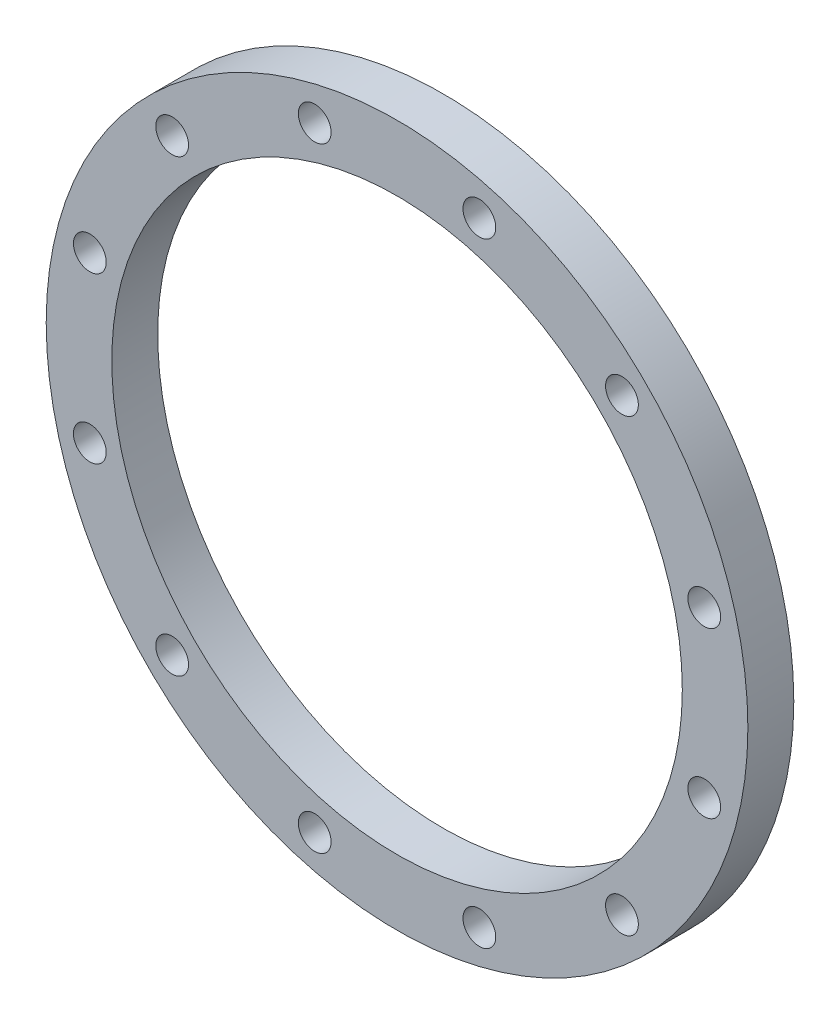
ISO-10303-21;
HEADER;
FILE_DESCRIPTION(('STEP AP214'),'2;1');
FILE_NAME('part.step','',(''),(''),'','','');
FILE_SCHEMA(('AUTOMOTIVE_DESIGN { 1 0 10303 214 1 1 1 1 }'));
ENDSEC;
DATA;
#1=APPLICATION_CONTEXT('core data for automotive mechanical design processes');
#2=APPLICATION_PROTOCOL_DEFINITION('international standard','automotive_design',2000,#1);
#3=PRODUCT_CONTEXT('',#1,'mechanical');
#4=PRODUCT('Part','Part','',(#3));
#5=PRODUCT_RELATED_PRODUCT_CATEGORY('part','',(#4));
#6=PRODUCT_DEFINITION_FORMATION('','',#4);
#7=PRODUCT_DEFINITION_CONTEXT('part definition',#1,'design');
#8=PRODUCT_DEFINITION('design','',#6,#7);
#9=PRODUCT_DEFINITION_SHAPE('','',#8);
#10=(LENGTH_UNIT() NAMED_UNIT(*) SI_UNIT(.MILLI.,.METRE.));
#11=(NAMED_UNIT(*) PLANE_ANGLE_UNIT() SI_UNIT($,.RADIAN.));
#12=(NAMED_UNIT(*) SI_UNIT($,.STERADIAN.) SOLID_ANGLE_UNIT());
#13=UNCERTAINTY_MEASURE_WITH_UNIT(LENGTH_MEASURE(1.E-05),#10,'distance_accuracy_value','');
#14=(GEOMETRIC_REPRESENTATION_CONTEXT(3) GLOBAL_UNCERTAINTY_ASSIGNED_CONTEXT((#13)) GLOBAL_UNIT_ASSIGNED_CONTEXT((#10,
#11,#12)) REPRESENTATION_CONTEXT('',''));
#15=CARTESIAN_POINT('',(0.,0.,0.));
#16=DIRECTION('',(0.,0.,1.));
#17=DIRECTION('',(1.,0.,0.));
#18=AXIS2_PLACEMENT_3D('',#15,#16,#17);
#19=CARTESIAN_POINT('',(0.,0.,70.));
#20=DIRECTION('',(0.,0.,1.));
#21=DIRECTION('',(1.,0.,0.));
#22=AXIS2_PLACEMENT_3D('',#19,#20,#21);
#23=PLANE('',#22);
#24=CARTESIAN_POINT('',(342.946788875482,342.946788875469,70.));
#25=DIRECTION('',(0.,0.,1.));
#26=DIRECTION('',(1.,0.,0.));
#27=AXIS2_PLACEMENT_3D('',#24,#25,#26);
#28=CIRCLE('',#27,25.);
#29=CARTESIAN_POINT('',(367.946788875482,342.946788875469,70.));
#30=VERTEX_POINT('',#29);
#31=EDGE_CURVE('E47',#30,#30,#28,.T.);
#32=ORIENTED_EDGE('',*,*,#31,.F.);
#33=EDGE_LOOP('',(#32));
#34=FACE_BOUND('',#33,.T.);
#35=CARTESIAN_POINT('',(468.474025750204,125.527236874702,70.));
#36=DIRECTION('',(0.,0.,1.));
#37=DIRECTION('',(1.,0.,0.));
#38=AXIS2_PLACEMENT_3D('',#35,#36,#37);
#39=CIRCLE('',#38,25.);
#40=CARTESIAN_POINT('',(493.474025750204,125.527236874702,70.));
#41=VERTEX_POINT('',#40);
#42=EDGE_CURVE('E52',#41,#41,#39,.T.);
#43=ORIENTED_EDGE('',*,*,#42,.F.);
#44=EDGE_LOOP('',(#43));
#45=FACE_BOUND('',#44,.T.);
#46=CARTESIAN_POINT('',(468.474025750189,-125.527236874755,70.));
#47=DIRECTION('',(0.,0.,1.));
#48=DIRECTION('',(1.,0.,0.));
#49=AXIS2_PLACEMENT_3D('',#46,#47,#48);
#50=CIRCLE('',#49,25.);
#51=CARTESIAN_POINT('',(493.474025750189,-125.527236874755,70.));
#52=VERTEX_POINT('',#51);
#53=EDGE_CURVE('E55',#52,#52,#50,.T.);
#54=ORIENTED_EDGE('',*,*,#53,.F.);
#55=EDGE_LOOP('',(#54));
#56=FACE_BOUND('',#55,.T.);
#57=CARTESIAN_POINT('',(342.946788875443,-342.946788875508,70.));
#58=DIRECTION('',(0.,0.,1.));
#59=DIRECTION('',(1.,0.,0.));
#60=AXIS2_PLACEMENT_3D('',#57,#58,#59);
#61=CIRCLE('',#60,25.);
#62=CARTESIAN_POINT('',(367.946788875443,-342.946788875508,70.));
#63=VERTEX_POINT('',#62);
#64=EDGE_CURVE('E58',#63,#63,#61,.T.);
#65=ORIENTED_EDGE('',*,*,#64,.F.);
#66=EDGE_LOOP('',(#65));
#67=FACE_BOUND('',#66,.T.);
#68=CARTESIAN_POINT('',(125.527236874666,-468.474025750213,70.));
#69=DIRECTION('',(0.,0.,1.));
#70=DIRECTION('',(1.,0.,0.));
#71=AXIS2_PLACEMENT_3D('',#68,#69,#70);
#72=CIRCLE('',#71,25.);
#73=CARTESIAN_POINT('',(150.527236874666,-468.474025750213,70.));
#74=VERTEX_POINT('',#73);
#75=EDGE_CURVE('E61',#74,#74,#72,.T.);
#76=ORIENTED_EDGE('',*,*,#75,.F.);
#77=EDGE_LOOP('',(#76));
#78=FACE_BOUND('',#77,.T.);
#79=CARTESIAN_POINT('',(-125.527236874791,-468.47402575018,70.));
#80=DIRECTION('',(0.,0.,1.));
#81=DIRECTION('',(1.,0.,0.));
#82=AXIS2_PLACEMENT_3D('',#79,#80,#81);
#83=CIRCLE('',#82,25.);
#84=CARTESIAN_POINT('',(-100.527236874791,-468.47402575018,70.));
#85=VERTEX_POINT('',#84);
#86=EDGE_CURVE('E64',#85,#85,#83,.T.);
#87=ORIENTED_EDGE('',*,*,#86,.F.);
#88=EDGE_LOOP('',(#87));
#89=FACE_BOUND('',#88,.T.);
#90=CARTESIAN_POINT('',(-342.946788875534,-342.946788875417,70.));
#91=DIRECTION('',(0.,0.,1.));
#92=DIRECTION('',(1.,0.,0.));
#93=AXIS2_PLACEMENT_3D('',#90,#91,#92);
#94=CIRCLE('',#93,25.);
#95=CARTESIAN_POINT('',(-317.946788875534,-342.946788875417,70.));
#96=VERTEX_POINT('',#95);
#97=EDGE_CURVE('E67',#96,#96,#94,.T.);
#98=ORIENTED_EDGE('',*,*,#97,.F.);
#99=EDGE_LOOP('',(#98));
#100=FACE_BOUND('',#99,.T.);
#101=CARTESIAN_POINT('',(-468.474025750223,-125.527236874631,70.));
#102=DIRECTION('',(0.,0.,1.));
#103=DIRECTION('',(1.,0.,0.));
#104=AXIS2_PLACEMENT_3D('',#101,#102,#103);
#105=CIRCLE('',#104,25.);
#106=CARTESIAN_POINT('',(-443.474025750223,-125.527236874631,70.));
#107=VERTEX_POINT('',#106);
#108=EDGE_CURVE('E70',#107,#107,#105,.T.);
#109=ORIENTED_EDGE('',*,*,#108,.F.);
#110=EDGE_LOOP('',(#109));
#111=FACE_BOUND('',#110,.T.);
#112=CARTESIAN_POINT('',(-468.47402575017,125.527236874826,70.));
#113=DIRECTION('',(0.,0.,1.));
#114=DIRECTION('',(1.,0.,0.));
#115=AXIS2_PLACEMENT_3D('',#112,#113,#114);
#116=CIRCLE('',#115,25.);
#117=CARTESIAN_POINT('',(-443.47402575017,125.527236874826,70.));
#118=VERTEX_POINT('',#117);
#119=EDGE_CURVE('E73',#118,#118,#116,.T.);
#120=ORIENTED_EDGE('',*,*,#119,.F.);
#121=EDGE_LOOP('',(#120));
#122=FACE_BOUND('',#121,.T.);
#123=CARTESIAN_POINT('',(-342.946788875391,342.94678887556,70.));
#124=DIRECTION('',(0.,0.,1.));
#125=DIRECTION('',(1.,0.,0.));
#126=AXIS2_PLACEMENT_3D('',#123,#124,#125);
#127=CIRCLE('',#126,25.);
#128=CARTESIAN_POINT('',(-317.946788875391,342.94678887556,70.));
#129=VERTEX_POINT('',#128);
#130=EDGE_CURVE('E76',#129,#129,#127,.T.);
#131=ORIENTED_EDGE('',*,*,#130,.F.);
#132=EDGE_LOOP('',(#131));
#133=FACE_BOUND('',#132,.T.);
#134=CARTESIAN_POINT('',(-125.527236874595,468.474025750232,70.));
#135=DIRECTION('',(0.,0.,1.));
#136=DIRECTION('',(1.,0.,0.));
#137=AXIS2_PLACEMENT_3D('',#134,#135,#136);
#138=CIRCLE('',#137,25.);
#139=CARTESIAN_POINT('',(-100.527236874595,468.474025750232,70.));
#140=VERTEX_POINT('',#139);
#141=EDGE_CURVE('E79',#140,#140,#138,.T.);
#142=ORIENTED_EDGE('',*,*,#141,.F.);
#143=EDGE_LOOP('',(#142));
#144=FACE_BOUND('',#143,.T.);
#145=CARTESIAN_POINT('',(125.527236874719,468.474025750199,70.));
#146=DIRECTION('',(0.,0.,1.));
#147=DIRECTION('',(1.,0.,0.));
#148=AXIS2_PLACEMENT_3D('',#145,#146,#147);
#149=CIRCLE('',#148,24.9999999999997);
#150=CARTESIAN_POINT('',(150.527236874719,468.474025750199,70.));
#151=VERTEX_POINT('',#150);
#152=EDGE_CURVE('E82',#151,#151,#149,.T.);
#153=ORIENTED_EDGE('',*,*,#152,.F.);
#154=EDGE_LOOP('',(#153));
#155=FACE_BOUND('',#154,.T.);
#156=CARTESIAN_POINT('',(0.,0.,70.));
#157=DIRECTION('',(0.,0.,1.));
#158=DIRECTION('',(1.,0.,0.));
#159=AXIS2_PLACEMENT_3D('',#156,#157,#158);
#160=CIRCLE('',#159,535.);
#161=CARTESIAN_POINT('',(535.,0.,70.));
#162=VERTEX_POINT('',#161);
#163=EDGE_CURVE('E10',#162,#162,#160,.T.);
#164=ORIENTED_EDGE('',*,*,#163,.T.);
#165=EDGE_LOOP('',(#164));
#166=FACE_BOUND('',#165,.T.);
#167=CARTESIAN_POINT('',(0.,0.,70.));
#168=DIRECTION('',(0.,0.,1.));
#169=DIRECTION('',(1.,0.,0.));
#170=AXIS2_PLACEMENT_3D('',#167,#168,#169);
#171=CIRCLE('',#170,435.);
#172=CARTESIAN_POINT('',(435.,0.,70.));
#173=VERTEX_POINT('',#172);
#174=EDGE_CURVE('E42',#173,#173,#171,.T.);
#175=ORIENTED_EDGE('',*,*,#174,.F.);
#176=EDGE_LOOP('',(#175));
#177=FACE_BOUND('',#176,.T.);
#178=ADVANCED_FACE('F31',(#34,#45,#56,#67,#78,#89,#100,#111,#122,#133,#144,#155,#166,#177),#23,.T.);
#179=CARTESIAN_POINT('',(0.,0.,0.));
#180=DIRECTION('',(0.,0.,1.));
#181=DIRECTION('',(1.,0.,0.));
#182=AXIS2_PLACEMENT_3D('',#179,#180,#181);
#183=PLANE('',#182);
#184=CARTESIAN_POINT('',(342.946788875482,342.946788875469,0.));
#185=DIRECTION('',(0.,0.,1.));
#186=DIRECTION('',(1.,0.,0.));
#187=AXIS2_PLACEMENT_3D('',#184,#185,#186);
#188=CIRCLE('',#187,25.);
#189=CARTESIAN_POINT('',(367.946788875482,342.946788875469,0.));
#190=VERTEX_POINT('',#189);
#191=EDGE_CURVE('E88',#190,#190,#188,.T.);
#192=ORIENTED_EDGE('',*,*,#191,.T.);
#193=EDGE_LOOP('',(#192));
#194=FACE_BOUND('',#193,.T.);
#195=CARTESIAN_POINT('',(468.474025750204,125.527236874702,0.));
#196=DIRECTION('',(0.,0.,1.));
#197=DIRECTION('',(1.,0.,0.));
#198=AXIS2_PLACEMENT_3D('',#195,#196,#197);
#199=CIRCLE('',#198,25.);
#200=CARTESIAN_POINT('',(493.474025750204,125.527236874702,0.));
#201=VERTEX_POINT('',#200);
#202=EDGE_CURVE('E108',#201,#201,#199,.T.);
#203=ORIENTED_EDGE('',*,*,#202,.T.);
#204=EDGE_LOOP('',(#203));
#205=FACE_BOUND('',#204,.T.);
#206=CARTESIAN_POINT('',(468.474025750189,-125.527236874755,0.));
#207=DIRECTION('',(0.,0.,1.));
#208=DIRECTION('',(1.,0.,0.));
#209=AXIS2_PLACEMENT_3D('',#206,#207,#208);
#210=CIRCLE('',#209,25.);
#211=CARTESIAN_POINT('',(493.474025750189,-125.527236874755,0.));
#212=VERTEX_POINT('',#211);
#213=EDGE_CURVE('E105',#212,#212,#210,.T.);
#214=ORIENTED_EDGE('',*,*,#213,.T.);
#215=EDGE_LOOP('',(#214));
#216=FACE_BOUND('',#215,.T.);
#217=CARTESIAN_POINT('',(342.946788875443,-342.946788875508,0.));
#218=DIRECTION('',(0.,0.,1.));
#219=DIRECTION('',(1.,0.,0.));
#220=AXIS2_PLACEMENT_3D('',#217,#218,#219);
#221=CIRCLE('',#220,25.);
#222=CARTESIAN_POINT('',(367.946788875443,-342.946788875508,0.));
#223=VERTEX_POINT('',#222);
#224=EDGE_CURVE('E102',#223,#223,#221,.T.);
#225=ORIENTED_EDGE('',*,*,#224,.T.);
#226=EDGE_LOOP('',(#225));
#227=FACE_BOUND('',#226,.T.);
#228=CARTESIAN_POINT('',(125.527236874666,-468.474025750213,0.));
#229=DIRECTION('',(0.,0.,1.));
#230=DIRECTION('',(1.,0.,0.));
#231=AXIS2_PLACEMENT_3D('',#228,#229,#230);
#232=CIRCLE('',#231,25.);
#233=CARTESIAN_POINT('',(150.527236874666,-468.474025750213,0.));
#234=VERTEX_POINT('',#233);
#235=EDGE_CURVE('E99',#234,#234,#232,.T.);
#236=ORIENTED_EDGE('',*,*,#235,.T.);
#237=EDGE_LOOP('',(#236));
#238=FACE_BOUND('',#237,.T.);
#239=CARTESIAN_POINT('',(-125.527236874791,-468.47402575018,0.));
#240=DIRECTION('',(0.,0.,1.));
#241=DIRECTION('',(1.,0.,0.));
#242=AXIS2_PLACEMENT_3D('',#239,#240,#241);
#243=CIRCLE('',#242,25.);
#244=CARTESIAN_POINT('',(-100.527236874791,-468.47402575018,0.));
#245=VERTEX_POINT('',#244);
#246=EDGE_CURVE('E96',#245,#245,#243,.T.);
#247=ORIENTED_EDGE('',*,*,#246,.T.);
#248=EDGE_LOOP('',(#247));
#249=FACE_BOUND('',#248,.T.);
#250=CARTESIAN_POINT('',(-342.946788875534,-342.946788875417,0.));
#251=DIRECTION('',(0.,0.,1.));
#252=DIRECTION('',(1.,0.,0.));
#253=AXIS2_PLACEMENT_3D('',#250,#251,#252);
#254=CIRCLE('',#253,25.);
#255=CARTESIAN_POINT('',(-317.946788875534,-342.946788875417,0.));
#256=VERTEX_POINT('',#255);
#257=EDGE_CURVE('E92',#256,#256,#254,.T.);
#258=ORIENTED_EDGE('',*,*,#257,.T.);
#259=EDGE_LOOP('',(#258));
#260=FACE_BOUND('',#259,.T.);
#261=CARTESIAN_POINT('',(-468.474025750223,-125.527236874631,0.));
#262=DIRECTION('',(0.,0.,1.));
#263=DIRECTION('',(1.,0.,0.));
#264=AXIS2_PLACEMENT_3D('',#261,#262,#263);
#265=CIRCLE('',#264,25.);
#266=CARTESIAN_POINT('',(-443.474025750223,-125.527236874631,0.));
#267=VERTEX_POINT('',#266);
#268=EDGE_CURVE('E89',#267,#267,#265,.T.);
#269=ORIENTED_EDGE('',*,*,#268,.T.);
#270=EDGE_LOOP('',(#269));
#271=FACE_BOUND('',#270,.T.);
#272=CARTESIAN_POINT('',(-468.47402575017,125.527236874826,0.));
#273=DIRECTION('',(0.,0.,1.));
#274=DIRECTION('',(1.,0.,0.));
#275=AXIS2_PLACEMENT_3D('',#272,#273,#274);
#276=CIRCLE('',#275,25.);
#277=CARTESIAN_POINT('',(-443.47402575017,125.527236874826,0.));
#278=VERTEX_POINT('',#277);
#279=EDGE_CURVE('E93',#278,#278,#276,.T.);
#280=ORIENTED_EDGE('',*,*,#279,.T.);
#281=EDGE_LOOP('',(#280));
#282=FACE_BOUND('',#281,.T.);
#283=CARTESIAN_POINT('',(-342.946788875391,342.94678887556,0.));
#284=DIRECTION('',(0.,0.,1.));
#285=DIRECTION('',(1.,0.,0.));
#286=AXIS2_PLACEMENT_3D('',#283,#284,#285);
#287=CIRCLE('',#286,25.);
#288=CARTESIAN_POINT('',(-317.946788875391,342.94678887556,0.));
#289=VERTEX_POINT('',#288);
#290=EDGE_CURVE('E116',#289,#289,#287,.T.);
#291=ORIENTED_EDGE('',*,*,#290,.T.);
#292=EDGE_LOOP('',(#291));
#293=FACE_BOUND('',#292,.T.);
#294=CARTESIAN_POINT('',(-125.527236874595,468.474025750232,0.));
#295=DIRECTION('',(0.,0.,1.));
#296=DIRECTION('',(1.,0.,0.));
#297=AXIS2_PLACEMENT_3D('',#294,#295,#296);
#298=CIRCLE('',#297,25.);
#299=CARTESIAN_POINT('',(-100.527236874595,468.474025750232,0.));
#300=VERTEX_POINT('',#299);
#301=EDGE_CURVE('E113',#300,#300,#298,.T.);
#302=ORIENTED_EDGE('',*,*,#301,.T.);
#303=EDGE_LOOP('',(#302));
#304=FACE_BOUND('',#303,.T.);
#305=CARTESIAN_POINT('',(125.527236874719,468.474025750199,0.));
#306=DIRECTION('',(0.,0.,1.));
#307=DIRECTION('',(1.,0.,0.));
#308=AXIS2_PLACEMENT_3D('',#305,#306,#307);
#309=CIRCLE('',#308,24.9999999999997);
#310=CARTESIAN_POINT('',(150.527236874719,468.474025750199,0.));
#311=VERTEX_POINT('',#310);
#312=EDGE_CURVE('E85',#311,#311,#309,.T.);
#313=ORIENTED_EDGE('',*,*,#312,.T.);
#314=EDGE_LOOP('',(#313));
#315=FACE_BOUND('',#314,.T.);
#316=CARTESIAN_POINT('',(0.,0.,0.));
#317=DIRECTION('',(0.,0.,1.));
#318=DIRECTION('',(1.,0.,0.));
#319=AXIS2_PLACEMENT_3D('',#316,#317,#318);
#320=CIRCLE('',#319,535.);
#321=CARTESIAN_POINT('',(535.,0.,0.));
#322=VERTEX_POINT('',#321);
#323=EDGE_CURVE('E35',#322,#322,#320,.T.);
#324=ORIENTED_EDGE('',*,*,#323,.F.);
#325=EDGE_LOOP('',(#324));
#326=FACE_BOUND('',#325,.T.);
#327=CARTESIAN_POINT('',(0.,0.,0.));
#328=DIRECTION('',(0.,0.,1.));
#329=DIRECTION('',(1.,0.,0.));
#330=AXIS2_PLACEMENT_3D('',#327,#328,#329);
#331=CIRCLE('',#330,435.);
#332=CARTESIAN_POINT('',(435.,0.,0.));
#333=VERTEX_POINT('',#332);
#334=EDGE_CURVE('E44',#333,#333,#331,.T.);
#335=ORIENTED_EDGE('',*,*,#334,.T.);
#336=EDGE_LOOP('',(#335));
#337=FACE_BOUND('',#336,.T.);
#338=ADVANCED_FACE('F122',(#194,#205,#216,#227,#238,#249,#260,#271,#282,#293,#304,#315,#326,
#337),#183,.F.);
#339=CARTESIAN_POINT('',(0.,0.,70.));
#340=DIRECTION('',(0.,0.,-1.));
#341=DIRECTION('',(-1.,0.,0.));
#342=AXIS2_PLACEMENT_3D('',#339,#340,#341);
#343=CYLINDRICAL_SURFACE('',#342,535.);
#344=ORIENTED_EDGE('',*,*,#163,.F.);
#345=EDGE_LOOP('',(#344));
#346=FACE_BOUND('',#345,.T.);
#347=ORIENTED_EDGE('',*,*,#323,.T.);
#348=EDGE_LOOP('',(#347));
#349=FACE_BOUND('',#348,.T.);
#350=ADVANCED_FACE('F33',(#346,#349),#343,.T.);
#351=CARTESIAN_POINT('',(0.,0.,70.));
#352=DIRECTION('',(0.,0.,-1.));
#353=DIRECTION('',(-1.,0.,0.));
#354=AXIS2_PLACEMENT_3D('',#351,#352,#353);
#355=CYLINDRICAL_SURFACE('',#354,435.);
#356=ORIENTED_EDGE('',*,*,#174,.T.);
#357=EDGE_LOOP('',(#356));
#358=FACE_BOUND('',#357,.T.);
#359=ORIENTED_EDGE('',*,*,#334,.F.);
#360=EDGE_LOOP('',(#359));
#361=FACE_BOUND('',#360,.T.);
#362=ADVANCED_FACE('F151',(#358,#361),#355,.F.);
#363=CARTESIAN_POINT('',(125.527236874719,468.474025750199,0.));
#364=DIRECTION('',(0.,0.,1.));
#365=DIRECTION('',(1.,0.,0.));
#366=AXIS2_PLACEMENT_3D('',#363,#364,#365);
#367=CYLINDRICAL_SURFACE('',#366,24.9999999999997);
#368=ORIENTED_EDGE('',*,*,#152,.T.);
#369=EDGE_LOOP('',(#368));
#370=FACE_BOUND('',#369,.T.);
#371=ORIENTED_EDGE('',*,*,#312,.F.);
#372=EDGE_LOOP('',(#371));
#373=FACE_BOUND('',#372,.T.);
#374=ADVANCED_FACE('F154',(#370,#373),#367,.F.);
#375=CARTESIAN_POINT('',(-125.527236874595,468.474025750232,0.));
#376=DIRECTION('',(0.,0.,1.));
#377=DIRECTION('',(1.,0.,0.));
#378=AXIS2_PLACEMENT_3D('',#375,#376,#377);
#379=CYLINDRICAL_SURFACE('',#378,25.);
#380=ORIENTED_EDGE('',*,*,#141,.T.);
#381=EDGE_LOOP('',(#380));
#382=FACE_BOUND('',#381,.T.);
#383=ORIENTED_EDGE('',*,*,#301,.F.);
#384=EDGE_LOOP('',(#383));
#385=FACE_BOUND('',#384,.T.);
#386=ADVANCED_FACE('F138',(#382,#385),#379,.F.);
#387=CARTESIAN_POINT('',(-342.946788875391,342.94678887556,0.));
#388=DIRECTION('',(0.,0.,1.));
#389=DIRECTION('',(1.,0.,0.));
#390=AXIS2_PLACEMENT_3D('',#387,#388,#389);
#391=CYLINDRICAL_SURFACE('',#390,25.);
#392=ORIENTED_EDGE('',*,*,#130,.T.);
#393=EDGE_LOOP('',(#392));
#394=FACE_BOUND('',#393,.T.);
#395=ORIENTED_EDGE('',*,*,#290,.F.);
#396=EDGE_LOOP('',(#395));
#397=FACE_BOUND('',#396,.T.);
#398=ADVANCED_FACE('F128',(#394,#397),#391,.F.);
#399=CARTESIAN_POINT('',(-468.47402575017,125.527236874826,0.));
#400=DIRECTION('',(0.,0.,1.));
#401=DIRECTION('',(1.,0.,0.));
#402=AXIS2_PLACEMENT_3D('',#399,#400,#401);
#403=CYLINDRICAL_SURFACE('',#402,25.);
#404=ORIENTED_EDGE('',*,*,#119,.T.);
#405=EDGE_LOOP('',(#404));
#406=FACE_BOUND('',#405,.T.);
#407=ORIENTED_EDGE('',*,*,#279,.F.);
#408=EDGE_LOOP('',(#407));
#409=FACE_BOUND('',#408,.T.);
#410=ADVANCED_FACE('F125',(#406,#409),#403,.F.);
#411=CARTESIAN_POINT('',(-468.474025750223,-125.527236874631,0.));
#412=DIRECTION('',(0.,0.,1.));
#413=DIRECTION('',(1.,0.,0.));
#414=AXIS2_PLACEMENT_3D('',#411,#412,#413);
#415=CYLINDRICAL_SURFACE('',#414,25.);
#416=ORIENTED_EDGE('',*,*,#108,.T.);
#417=EDGE_LOOP('',(#416));
#418=FACE_BOUND('',#417,.T.);
#419=ORIENTED_EDGE('',*,*,#268,.F.);
#420=EDGE_LOOP('',(#419));
#421=FACE_BOUND('',#420,.T.);
#422=ADVANCED_FACE('F127',(#418,#421),#415,.F.);
#423=CARTESIAN_POINT('',(-342.946788875534,-342.946788875417,0.));
#424=DIRECTION('',(0.,0.,1.));
#425=DIRECTION('',(1.,0.,0.));
#426=AXIS2_PLACEMENT_3D('',#423,#424,#425);
#427=CYLINDRICAL_SURFACE('',#426,25.);
#428=ORIENTED_EDGE('',*,*,#97,.T.);
#429=EDGE_LOOP('',(#428));
#430=FACE_BOUND('',#429,.T.);
#431=ORIENTED_EDGE('',*,*,#257,.F.);
#432=EDGE_LOOP('',(#431));
#433=FACE_BOUND('',#432,.T.);
#434=ADVANCED_FACE('F135',(#430,#433),#427,.F.);
#435=CARTESIAN_POINT('',(-125.527236874791,-468.47402575018,0.));
#436=DIRECTION('',(0.,0.,1.));
#437=DIRECTION('',(1.,0.,0.));
#438=AXIS2_PLACEMENT_3D('',#435,#436,#437);
#439=CYLINDRICAL_SURFACE('',#438,25.);
#440=ORIENTED_EDGE('',*,*,#86,.T.);
#441=EDGE_LOOP('',(#440));
#442=FACE_BOUND('',#441,.T.);
#443=ORIENTED_EDGE('',*,*,#246,.F.);
#444=EDGE_LOOP('',(#443));
#445=FACE_BOUND('',#444,.T.);
#446=ADVANCED_FACE('F161',(#442,#445),#439,.F.);
#447=CARTESIAN_POINT('',(125.527236874666,-468.474025750213,0.));
#448=DIRECTION('',(0.,0.,1.));
#449=DIRECTION('',(1.,0.,0.));
#450=AXIS2_PLACEMENT_3D('',#447,#448,#449);
#451=CYLINDRICAL_SURFACE('',#450,25.);
#452=ORIENTED_EDGE('',*,*,#75,.T.);
#453=EDGE_LOOP('',(#452));
#454=FACE_BOUND('',#453,.T.);
#455=ORIENTED_EDGE('',*,*,#235,.F.);
#456=EDGE_LOOP('',(#455));
#457=FACE_BOUND('',#456,.T.);
#458=ADVANCED_FACE('F165',(#454,#457),#451,.F.);
#459=CARTESIAN_POINT('',(342.946788875443,-342.946788875508,0.));
#460=DIRECTION('',(0.,0.,1.));
#461=DIRECTION('',(1.,0.,0.));
#462=AXIS2_PLACEMENT_3D('',#459,#460,#461);
#463=CYLINDRICAL_SURFACE('',#462,25.);
#464=ORIENTED_EDGE('',*,*,#64,.T.);
#465=EDGE_LOOP('',(#464));
#466=FACE_BOUND('',#465,.T.);
#467=ORIENTED_EDGE('',*,*,#224,.F.);
#468=EDGE_LOOP('',(#467));
#469=FACE_BOUND('',#468,.T.);
#470=ADVANCED_FACE('F169',(#466,#469),#463,.F.);
#471=CARTESIAN_POINT('',(468.474025750189,-125.527236874755,0.));
#472=DIRECTION('',(0.,0.,1.));
#473=DIRECTION('',(1.,0.,0.));
#474=AXIS2_PLACEMENT_3D('',#471,#472,#473);
#475=CYLINDRICAL_SURFACE('',#474,25.);
#476=ORIENTED_EDGE('',*,*,#53,.T.);
#477=EDGE_LOOP('',(#476));
#478=FACE_BOUND('',#477,.T.);
#479=ORIENTED_EDGE('',*,*,#213,.F.);
#480=EDGE_LOOP('',(#479));
#481=FACE_BOUND('',#480,.T.);
#482=ADVANCED_FACE('F173',(#478,#481),#475,.F.);
#483=CARTESIAN_POINT('',(468.474025750204,125.527236874702,0.));
#484=DIRECTION('',(0.,0.,1.));
#485=DIRECTION('',(1.,0.,0.));
#486=AXIS2_PLACEMENT_3D('',#483,#484,#485);
#487=CYLINDRICAL_SURFACE('',#486,25.);
#488=ORIENTED_EDGE('',*,*,#42,.T.);
#489=EDGE_LOOP('',(#488));
#490=FACE_BOUND('',#489,.T.);
#491=ORIENTED_EDGE('',*,*,#202,.F.);
#492=EDGE_LOOP('',(#491));
#493=FACE_BOUND('',#492,.T.);
#494=ADVANCED_FACE('F177',(#490,#493),#487,.F.);
#495=CARTESIAN_POINT('',(342.946788875482,342.946788875469,0.));
#496=DIRECTION('',(0.,0.,1.));
#497=DIRECTION('',(1.,0.,0.));
#498=AXIS2_PLACEMENT_3D('',#495,#496,#497);
#499=CYLINDRICAL_SURFACE('',#498,25.);
#500=ORIENTED_EDGE('',*,*,#31,.T.);
#501=EDGE_LOOP('',(#500));
#502=FACE_BOUND('',#501,.T.);
#503=ORIENTED_EDGE('',*,*,#191,.F.);
#504=EDGE_LOOP('',(#503));
#505=FACE_BOUND('',#504,.T.);
#506=ADVANCED_FACE('F181',(#502,#505),#499,.F.);
#507=CLOSED_SHELL('',(#178,#338,#350,#362,#374,#386,#398,#410,#422,#434,#446,#458,#470,#482,
#494,#506));
#508=MANIFOLD_SOLID_BREP('B2',#507);
#509=ADVANCED_BREP_SHAPE_REPRESENTATION('',(#18,#508),#14);
#510=SHAPE_DEFINITION_REPRESENTATION(#9,#509);
ENDSEC;
END-ISO-10303-21;
